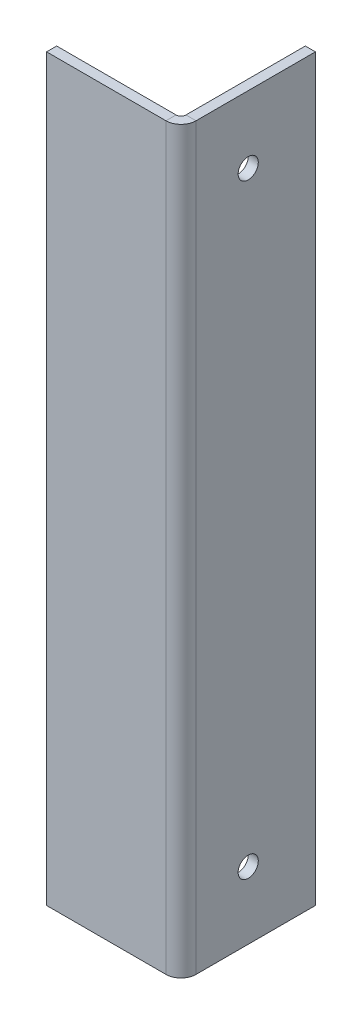
ISO-10303-21;
HEADER;
FILE_DESCRIPTION(('STEP AP214'),'2;1');
FILE_NAME('part.step','',(''),(''),'','','');
FILE_SCHEMA(('AUTOMOTIVE_DESIGN { 1 0 10303 214 1 1 1 1 }'));
ENDSEC;
DATA;
#1=APPLICATION_CONTEXT('core data for automotive mechanical design processes');
#2=APPLICATION_PROTOCOL_DEFINITION('international standard','automotive_design',2000,#1);
#3=PRODUCT_CONTEXT('',#1,'mechanical');
#4=PRODUCT('Part','Part','',(#3));
#5=PRODUCT_RELATED_PRODUCT_CATEGORY('part','',(#4));
#6=PRODUCT_DEFINITION_FORMATION('','',#4);
#7=PRODUCT_DEFINITION_CONTEXT('part definition',#1,'design');
#8=PRODUCT_DEFINITION('design','',#6,#7);
#9=PRODUCT_DEFINITION_SHAPE('','',#8);
#10=(LENGTH_UNIT() NAMED_UNIT(*) SI_UNIT(.MILLI.,.METRE.));
#11=(NAMED_UNIT(*) PLANE_ANGLE_UNIT() SI_UNIT($,.RADIAN.));
#12=(NAMED_UNIT(*) SI_UNIT($,.STERADIAN.) SOLID_ANGLE_UNIT());
#13=UNCERTAINTY_MEASURE_WITH_UNIT(LENGTH_MEASURE(1.E-05),#10,'distance_accuracy_value','');
#14=(GEOMETRIC_REPRESENTATION_CONTEXT(3) GLOBAL_UNCERTAINTY_ASSIGNED_CONTEXT((#13)) GLOBAL_UNIT_ASSIGNED_CONTEXT((#10,
#11,#12)) REPRESENTATION_CONTEXT('',''));
#15=CARTESIAN_POINT('',(0.,0.,0.));
#16=DIRECTION('',(0.,0.,1.));
#17=DIRECTION('',(1.,0.,0.));
#18=AXIS2_PLACEMENT_3D('',#15,#16,#17);
#19=CARTESIAN_POINT('',(-2.2366,110.,20.));
#20=DIRECTION('',(0.,1.,0.));
#21=DIRECTION('',(0.,0.,1.));
#22=AXIS2_PLACEMENT_3D('',#19,#20,#21);
#23=PLANE('',#22);
#24=DIRECTION('',(0.,0.,-1.));
#25=VECTOR('',#24,1.);
#26=CARTESIAN_POINT('',(-2.2366,110.,20.));
#27=LINE('',#26,#25);
#28=CARTESIAN_POINT('',(-2.2366,110.,20.));
#29=VERTEX_POINT('',#28);
#30=CARTESIAN_POINT('',(-2.2366,110.,18.5));
#31=VERTEX_POINT('',#30);
#32=EDGE_CURVE('E13',#29,#31,#27,.T.);
#33=ORIENTED_EDGE('',*,*,#32,.F.);
#34=CARTESIAN_POINT('',(-2.2366,110.,17.7634));
#35=DIRECTION('',(0.,1.,0.));
#36=DIRECTION('',(0.,0.,1.));
#37=AXIS2_PLACEMENT_3D('',#34,#35,#36);
#38=CIRCLE('',#37,2.2366);
#39=CARTESIAN_POINT('',(0.,110.,17.7634));
#40=VERTEX_POINT('',#39);
#41=EDGE_CURVE('E145',#40,#29,#38,.F.);
#42=ORIENTED_EDGE('',*,*,#41,.F.);
#43=DIRECTION('',(1.,0.,0.));
#44=VECTOR('',#43,1.);
#45=CARTESIAN_POINT('',(-1.5,110.,17.7634));
#46=LINE('',#45,#44);
#47=CARTESIAN_POINT('',(-1.5,110.,17.7634));
#48=VERTEX_POINT('',#47);
#49=EDGE_CURVE('E56',#48,#40,#46,.T.);
#50=ORIENTED_EDGE('',*,*,#49,.F.);
#51=CARTESIAN_POINT('',(-2.2366,110.,17.7634));
#52=DIRECTION('',(0.,1.,0.));
#53=DIRECTION('',(1.,0.,0.));
#54=AXIS2_PLACEMENT_3D('',#51,#52,#53);
#55=CIRCLE('',#54,0.7366);
#56=EDGE_CURVE('E138',#48,#31,#55,.F.);
#57=ORIENTED_EDGE('',*,*,#56,.T.);
#58=EDGE_LOOP('',(#33,#42,#50,#57));
#59=FACE_BOUND('',#58,.T.);
#60=ADVANCED_FACE('F48',(#59),#23,.T.);
#61=CARTESIAN_POINT('',(-1.5,110.,17.7634));
#62=DIRECTION('',(0.,1.,0.));
#63=DIRECTION('',(0.,0.,1.));
#64=AXIS2_PLACEMENT_3D('',#61,#62,#63);
#65=PLANE('',#64);
#66=DIRECTION('',(-1.,0.,0.));
#67=VECTOR('',#66,1.);
#68=CARTESIAN_POINT('',(0.,110.,20.));
#69=LINE('',#68,#67);
#70=CARTESIAN_POINT('',(-20.,110.,20.));
#71=VERTEX_POINT('',#70);
#72=EDGE_CURVE('E195',#29,#71,#69,.T.);
#73=ORIENTED_EDGE('',*,*,#72,.F.);
#74=ORIENTED_EDGE('',*,*,#32,.T.);
#75=DIRECTION('',(1.,0.,0.));
#76=VECTOR('',#75,1.);
#77=CARTESIAN_POINT('',(0.,110.,18.5));
#78=LINE('',#77,#76);
#79=CARTESIAN_POINT('',(-20.,110.,18.5));
#80=VERTEX_POINT('',#79);
#81=EDGE_CURVE('E104',#31,#80,#78,.F.);
#82=ORIENTED_EDGE('',*,*,#81,.T.);
#83=DIRECTION('',(0.,0.,-1.));
#84=VECTOR('',#83,1.);
#85=CARTESIAN_POINT('',(-20.,110.,20.));
#86=LINE('',#85,#84);
#87=EDGE_CURVE('E361',#71,#80,#86,.T.);
#88=ORIENTED_EDGE('',*,*,#87,.F.);
#89=EDGE_LOOP('',(#73,#74,#82,#88));
#90=FACE_BOUND('',#89,.T.);
#91=ADVANCED_FACE('F203',(#90),#65,.T.);
#92=CARTESIAN_POINT('',(0.,0.,17.7634));
#93=DIRECTION('',(0.,-1.,0.));
#94=DIRECTION('',(0.,0.,-1.));
#95=AXIS2_PLACEMENT_3D('',#92,#93,#94);
#96=PLANE('',#95);
#97=DIRECTION('',(-1.,0.,0.));
#98=VECTOR('',#97,1.);
#99=CARTESIAN_POINT('',(0.,0.,17.7634));
#100=LINE('',#99,#98);
#101=CARTESIAN_POINT('',(0.,0.,17.7634));
#102=VERTEX_POINT('',#101);
#103=CARTESIAN_POINT('',(-1.5,0.,17.7634));
#104=VERTEX_POINT('',#103);
#105=EDGE_CURVE('E91',#102,#104,#100,.T.);
#106=ORIENTED_EDGE('',*,*,#105,.F.);
#107=CARTESIAN_POINT('',(-2.2366,0.,17.7634));
#108=DIRECTION('',(0.,1.,0.));
#109=DIRECTION('',(0.,0.,1.));
#110=AXIS2_PLACEMENT_3D('',#107,#108,#109);
#111=CIRCLE('',#110,2.2366);
#112=CARTESIAN_POINT('',(-2.2366,0.,20.));
#113=VERTEX_POINT('',#112);
#114=EDGE_CURVE('E161',#102,#113,#111,.F.);
#115=ORIENTED_EDGE('',*,*,#114,.T.);
#116=DIRECTION('',(0.,0.,1.));
#117=VECTOR('',#116,1.);
#118=CARTESIAN_POINT('',(-2.2366,0.,18.5));
#119=LINE('',#118,#117);
#120=CARTESIAN_POINT('',(-2.2366,0.,18.5));
#121=VERTEX_POINT('',#120);
#122=EDGE_CURVE('E98',#121,#113,#119,.T.);
#123=ORIENTED_EDGE('',*,*,#122,.F.);
#124=CARTESIAN_POINT('',(-2.2366,0.,17.7634));
#125=DIRECTION('',(0.,1.,0.));
#126=DIRECTION('',(1.,0.,0.));
#127=AXIS2_PLACEMENT_3D('',#124,#125,#126);
#128=CIRCLE('',#127,0.7366);
#129=EDGE_CURVE('E168',#104,#121,#128,.F.);
#130=ORIENTED_EDGE('',*,*,#129,.F.);
#131=EDGE_LOOP('',(#106,#115,#123,#130));
#132=FACE_BOUND('',#131,.T.);
#133=ADVANCED_FACE('F201',(#132),#96,.T.);
#134=CARTESIAN_POINT('',(-2.2366,0.,18.5));
#135=DIRECTION('',(0.,-1.,0.));
#136=DIRECTION('',(0.,0.,-1.));
#137=AXIS2_PLACEMENT_3D('',#134,#135,#136);
#138=PLANE('',#137);
#139=DIRECTION('',(0.,0.,1.));
#140=VECTOR('',#139,1.);
#141=CARTESIAN_POINT('',(0.,0.,0.));
#142=LINE('',#141,#140);
#143=CARTESIAN_POINT('',(0.,0.,0.));
#144=VERTEX_POINT('',#143);
#145=EDGE_CURVE('E163',#144,#102,#142,.T.);
#146=ORIENTED_EDGE('',*,*,#145,.T.);
#147=ORIENTED_EDGE('',*,*,#105,.T.);
#148=DIRECTION('',(0.,0.,1.));
#149=VECTOR('',#148,1.);
#150=CARTESIAN_POINT('',(-1.5,0.,0.));
#151=LINE('',#150,#149);
#152=CARTESIAN_POINT('',(-1.5,0.,0.));
#153=VERTEX_POINT('',#152);
#154=EDGE_CURVE('E166',#153,#104,#151,.T.);
#155=ORIENTED_EDGE('',*,*,#154,.F.);
#156=DIRECTION('',(1.,0.,0.));
#157=VECTOR('',#156,1.);
#158=CARTESIAN_POINT('',(-1.5,0.,0.));
#159=LINE('',#158,#157);
#160=EDGE_CURVE('E126',#153,#144,#159,.T.);
#161=ORIENTED_EDGE('',*,*,#160,.T.);
#162=EDGE_LOOP('',(#146,#147,#155,#161));
#163=FACE_BOUND('',#162,.T.);
#164=ADVANCED_FACE('F197',(#163),#138,.T.);
#165=CARTESIAN_POINT('',(0.,110.,18.5));
#166=DIRECTION('',(0.,0.,1.));
#167=DIRECTION('',(1.,0.,0.));
#168=AXIS2_PLACEMENT_3D('',#165,#166,#167);
#169=PLANE('',#168);
#170=DIRECTION('',(1.,0.,0.));
#171=VECTOR('',#170,1.);
#172=CARTESIAN_POINT('',(0.,0.,18.5));
#173=LINE('',#172,#171);
#174=CARTESIAN_POINT('',(-20.,0.,18.5));
#175=VERTEX_POINT('',#174);
#176=EDGE_CURVE('E151',#121,#175,#173,.F.);
#177=ORIENTED_EDGE('',*,*,#176,.T.);
#178=DIRECTION('',(0.,-1.,0.));
#179=VECTOR('',#178,1.);
#180=CARTESIAN_POINT('',(-20.,110.,18.5));
#181=LINE('',#180,#179);
#182=EDGE_CURVE('E182',#80,#175,#181,.T.);
#183=ORIENTED_EDGE('',*,*,#182,.F.);
#184=ORIENTED_EDGE('',*,*,#81,.F.);
#185=DIRECTION('',(0.,-1.,0.));
#186=VECTOR('',#185,1.);
#187=CARTESIAN_POINT('',(-2.2366,110.,18.5));
#188=LINE('',#187,#186);
#189=EDGE_CURVE('E150',#31,#121,#188,.T.);
#190=ORIENTED_EDGE('',*,*,#189,.T.);
#191=EDGE_LOOP('',(#177,#183,#184,#190));
#192=FACE_BOUND('',#191,.T.);
#193=ADVANCED_FACE('F209',(#192),#169,.F.);
#194=CARTESIAN_POINT('',(-20.,110.,20.));
#195=DIRECTION('',(-1.,0.,0.));
#196=DIRECTION('',(0.,0.,1.));
#197=AXIS2_PLACEMENT_3D('',#194,#195,#196);
#198=PLANE('',#197);
#199=DIRECTION('',(0.,0.,-1.));
#200=VECTOR('',#199,1.);
#201=CARTESIAN_POINT('',(-20.,0.,20.));
#202=LINE('',#201,#200);
#203=CARTESIAN_POINT('',(-20.,0.,20.));
#204=VERTEX_POINT('',#203);
#205=EDGE_CURVE('E154',#204,#175,#202,.T.);
#206=ORIENTED_EDGE('',*,*,#205,.F.);
#207=DIRECTION('',(0.,-1.,0.));
#208=VECTOR('',#207,1.);
#209=CARTESIAN_POINT('',(-20.,110.,20.));
#210=LINE('',#209,#208);
#211=EDGE_CURVE('E180',#71,#204,#210,.T.);
#212=ORIENTED_EDGE('',*,*,#211,.F.);
#213=ORIENTED_EDGE('',*,*,#87,.T.);
#214=ORIENTED_EDGE('',*,*,#182,.T.);
#215=EDGE_LOOP('',(#206,#212,#213,#214));
#216=FACE_BOUND('',#215,.T.);
#217=ADVANCED_FACE('F240',(#216),#198,.T.);
#218=CARTESIAN_POINT('',(0.,110.,20.));
#219=DIRECTION('',(0.,0.,1.));
#220=DIRECTION('',(1.,0.,0.));
#221=AXIS2_PLACEMENT_3D('',#218,#219,#220);
#222=PLANE('',#221);
#223=DIRECTION('',(-1.,0.,0.));
#224=VECTOR('',#223,1.);
#225=CARTESIAN_POINT('',(0.,0.,20.));
#226=LINE('',#225,#224);
#227=EDGE_CURVE('E158',#113,#204,#226,.T.);
#228=ORIENTED_EDGE('',*,*,#227,.F.);
#229=DIRECTION('',(0.,-1.,0.));
#230=VECTOR('',#229,1.);
#231=CARTESIAN_POINT('',(-2.2366,110.,20.));
#232=LINE('',#231,#230);
#233=EDGE_CURVE('E177',#29,#113,#232,.T.);
#234=ORIENTED_EDGE('',*,*,#233,.F.);
#235=ORIENTED_EDGE('',*,*,#72,.T.);
#236=ORIENTED_EDGE('',*,*,#211,.T.);
#237=EDGE_LOOP('',(#228,#234,#235,#236));
#238=FACE_BOUND('',#237,.T.);
#239=ADVANCED_FACE('F251',(#238),#222,.T.);
#240=CARTESIAN_POINT('',(-2.2366,110.,17.7634));
#241=DIRECTION('',(0.,-1.,0.));
#242=DIRECTION('',(0.,0.,-1.));
#243=AXIS2_PLACEMENT_3D('',#240,#241,#242);
#244=CYLINDRICAL_SURFACE('',#243,2.2366);
#245=ORIENTED_EDGE('',*,*,#114,.F.);
#246=DIRECTION('',(0.,-1.,0.));
#247=VECTOR('',#246,1.);
#248=CARTESIAN_POINT('',(0.,110.,17.7634));
#249=LINE('',#248,#247);
#250=EDGE_CURVE('E174',#40,#102,#249,.T.);
#251=ORIENTED_EDGE('',*,*,#250,.F.);
#252=ORIENTED_EDGE('',*,*,#41,.T.);
#253=ORIENTED_EDGE('',*,*,#233,.T.);
#254=EDGE_LOOP('',(#245,#251,#252,#253));
#255=FACE_BOUND('',#254,.T.);
#256=ADVANCED_FACE('F191',(#255),#244,.T.);
#257=CARTESIAN_POINT('',(0.,110.,0.));
#258=DIRECTION('',(1.,0.,0.));
#259=DIRECTION('',(0.,0.,-1.));
#260=AXIS2_PLACEMENT_3D('',#257,#258,#259);
#261=PLANE('',#260);
#262=CARTESIAN_POINT('',(0.,100.,10.));
#263=DIRECTION('',(1.,0.,0.));
#264=DIRECTION('',(0.,0.,-1.));
#265=AXIS2_PLACEMENT_3D('',#262,#263,#264);
#266=CIRCLE('',#265,1.49999999999999);
#267=CARTESIAN_POINT('',(0.,100.,8.50000000000001));
#268=VERTEX_POINT('',#267);
#269=EDGE_CURVE('E348',#268,#268,#266,.T.);
#270=ORIENTED_EDGE('',*,*,#269,.F.);
#271=EDGE_LOOP('',(#270));
#272=FACE_BOUND('',#271,.T.);
#273=CARTESIAN_POINT('',(0.,10.,10.));
#274=DIRECTION('',(1.,0.,0.));
#275=DIRECTION('',(0.,0.,-1.));
#276=AXIS2_PLACEMENT_3D('',#273,#274,#275);
#277=CIRCLE('',#276,1.49999999999999);
#278=CARTESIAN_POINT('',(0.,10.,8.50000000000001));
#279=VERTEX_POINT('',#278);
#280=EDGE_CURVE('E155',#279,#279,#277,.T.);
#281=ORIENTED_EDGE('',*,*,#280,.F.);
#282=EDGE_LOOP('',(#281));
#283=FACE_BOUND('',#282,.T.);
#284=ORIENTED_EDGE('',*,*,#145,.F.);
#285=DIRECTION('',(0.,-1.,0.));
#286=VECTOR('',#285,1.);
#287=CARTESIAN_POINT('',(0.,110.,0.));
#288=LINE('',#287,#286);
#289=CARTESIAN_POINT('',(0.,110.,0.));
#290=VERTEX_POINT('',#289);
#291=EDGE_CURVE('E128',#290,#144,#288,.T.);
#292=ORIENTED_EDGE('',*,*,#291,.F.);
#293=DIRECTION('',(0.,0.,1.));
#294=VECTOR('',#293,1.);
#295=CARTESIAN_POINT('',(0.,110.,0.));
#296=LINE('',#295,#294);
#297=EDGE_CURVE('E143',#290,#40,#296,.T.);
#298=ORIENTED_EDGE('',*,*,#297,.T.);
#299=ORIENTED_EDGE('',*,*,#250,.T.);
#300=EDGE_LOOP('',(#284,#292,#298,#299));
#301=FACE_BOUND('',#300,.T.);
#302=ADVANCED_FACE('F196',(#272,#283,#301),#261,.T.);
#303=CARTESIAN_POINT('',(-1.5,110.,0.));
#304=DIRECTION('',(0.,0.,-1.));
#305=DIRECTION('',(-1.,0.,0.));
#306=AXIS2_PLACEMENT_3D('',#303,#304,#305);
#307=PLANE('',#306);
#308=ORIENTED_EDGE('',*,*,#160,.F.);
#309=DIRECTION('',(0.,-1.,0.));
#310=VECTOR('',#309,1.);
#311=CARTESIAN_POINT('',(-1.5,110.,0.));
#312=LINE('',#311,#310);
#313=CARTESIAN_POINT('',(-1.5,110.,0.));
#314=VERTEX_POINT('',#313);
#315=EDGE_CURVE('E120',#314,#153,#312,.T.);
#316=ORIENTED_EDGE('',*,*,#315,.F.);
#317=DIRECTION('',(1.,0.,0.));
#318=VECTOR('',#317,1.);
#319=CARTESIAN_POINT('',(-1.5,110.,0.));
#320=LINE('',#319,#318);
#321=EDGE_CURVE('E124',#314,#290,#320,.T.);
#322=ORIENTED_EDGE('',*,*,#321,.T.);
#323=ORIENTED_EDGE('',*,*,#291,.T.);
#324=EDGE_LOOP('',(#308,#316,#322,#323));
#325=FACE_BOUND('',#324,.T.);
#326=ADVANCED_FACE('F122',(#325),#307,.T.);
#327=CARTESIAN_POINT('',(-1.5,110.,0.));
#328=DIRECTION('',(1.,0.,0.));
#329=DIRECTION('',(0.,0.,-1.));
#330=AXIS2_PLACEMENT_3D('',#327,#328,#329);
#331=PLANE('',#330);
#332=CARTESIAN_POINT('',(-1.5,100.,10.));
#333=DIRECTION('',(-1.,0.,0.));
#334=DIRECTION('',(0.,0.,1.));
#335=AXIS2_PLACEMENT_3D('',#332,#333,#334);
#336=CIRCLE('',#335,1.49999999999999);
#337=CARTESIAN_POINT('',(-1.5,100.,11.5));
#338=VERTEX_POINT('',#337);
#339=EDGE_CURVE('E351',#338,#338,#336,.T.);
#340=ORIENTED_EDGE('',*,*,#339,.F.);
#341=EDGE_LOOP('',(#340));
#342=FACE_BOUND('',#341,.T.);
#343=CARTESIAN_POINT('',(-1.5,10.,10.));
#344=DIRECTION('',(-1.,0.,0.));
#345=DIRECTION('',(0.,0.,1.));
#346=AXIS2_PLACEMENT_3D('',#343,#344,#345);
#347=CIRCLE('',#346,1.49999999999999);
#348=CARTESIAN_POINT('',(-1.5,10.,11.5));
#349=VERTEX_POINT('',#348);
#350=EDGE_CURVE('E353',#349,#349,#347,.T.);
#351=ORIENTED_EDGE('',*,*,#350,.F.);
#352=EDGE_LOOP('',(#351));
#353=FACE_BOUND('',#352,.T.);
#354=ORIENTED_EDGE('',*,*,#154,.T.);
#355=DIRECTION('',(0.,-1.,0.));
#356=VECTOR('',#355,1.);
#357=CARTESIAN_POINT('',(-1.5,110.,17.7634));
#358=LINE('',#357,#356);
#359=EDGE_CURVE('E129',#48,#104,#358,.T.);
#360=ORIENTED_EDGE('',*,*,#359,.F.);
#361=DIRECTION('',(0.,0.,1.));
#362=VECTOR('',#361,1.);
#363=CARTESIAN_POINT('',(-1.5,110.,0.));
#364=LINE('',#363,#362);
#365=EDGE_CURVE('E133',#314,#48,#364,.T.);
#366=ORIENTED_EDGE('',*,*,#365,.F.);
#367=ORIENTED_EDGE('',*,*,#315,.T.);
#368=EDGE_LOOP('',(#354,#360,#366,#367));
#369=FACE_BOUND('',#368,.T.);
#370=ADVANCED_FACE('F134',(#342,#353,#369),#331,.F.);
#371=CARTESIAN_POINT('',(-2.2366,110.,17.7634));
#372=DIRECTION('',(0.,-1.,0.));
#373=DIRECTION('',(0.,0.,-1.));
#374=AXIS2_PLACEMENT_3D('',#371,#372,#373);
#375=CYLINDRICAL_SURFACE('',#374,0.7366);
#376=ORIENTED_EDGE('',*,*,#129,.T.);
#377=ORIENTED_EDGE('',*,*,#189,.F.);
#378=ORIENTED_EDGE('',*,*,#56,.F.);
#379=ORIENTED_EDGE('',*,*,#359,.T.);
#380=EDGE_LOOP('',(#376,#377,#378,#379));
#381=FACE_BOUND('',#380,.T.);
#382=ADVANCED_FACE('F199',(#381),#375,.F.);
#383=CARTESIAN_POINT('',(-2.2366,110.,17.7634));
#384=DIRECTION('',(0.,1.,0.));
#385=DIRECTION('',(1.,0.,0.));
#386=AXIS2_PLACEMENT_3D('',#383,#384,#385);
#387=PLANE('',#386);
#388=ORIENTED_EDGE('',*,*,#365,.T.);
#389=ORIENTED_EDGE('',*,*,#49,.T.);
#390=ORIENTED_EDGE('',*,*,#297,.F.);
#391=ORIENTED_EDGE('',*,*,#321,.F.);
#392=EDGE_LOOP('',(#388,#389,#390,#391));
#393=FACE_BOUND('',#392,.T.);
#394=ADVANCED_FACE('F141',(#393),#387,.T.);
#395=CARTESIAN_POINT('',(-2.2366,0.,17.7634));
#396=DIRECTION('',(0.,1.,0.));
#397=DIRECTION('',(1.,0.,0.));
#398=AXIS2_PLACEMENT_3D('',#395,#396,#397);
#399=PLANE('',#398);
#400=ORIENTED_EDGE('',*,*,#176,.F.);
#401=ORIENTED_EDGE('',*,*,#122,.T.);
#402=ORIENTED_EDGE('',*,*,#227,.T.);
#403=ORIENTED_EDGE('',*,*,#205,.T.);
#404=EDGE_LOOP('',(#400,#401,#402,#403));
#405=FACE_BOUND('',#404,.T.);
#406=ADVANCED_FACE('F295',(#405),#399,.F.);
#407=CARTESIAN_POINT('',(-1.5,10.,10.));
#408=DIRECTION('',(-1.,0.,0.));
#409=DIRECTION('',(0.,0.,1.));
#410=AXIS2_PLACEMENT_3D('',#407,#408,#409);
#411=CYLINDRICAL_SURFACE('',#410,1.49999999999999);
#412=ORIENTED_EDGE('',*,*,#280,.T.);
#413=EDGE_LOOP('',(#412));
#414=FACE_BOUND('',#413,.T.);
#415=ORIENTED_EDGE('',*,*,#350,.T.);
#416=EDGE_LOOP('',(#415));
#417=FACE_BOUND('',#416,.T.);
#418=ADVANCED_FACE('F305',(#414,#417),#411,.F.);
#419=CARTESIAN_POINT('',(-1.5,100.,10.));
#420=DIRECTION('',(-1.,0.,0.));
#421=DIRECTION('',(0.,0.,1.));
#422=AXIS2_PLACEMENT_3D('',#419,#420,#421);
#423=CYLINDRICAL_SURFACE('',#422,1.49999999999999);
#424=ORIENTED_EDGE('',*,*,#269,.T.);
#425=EDGE_LOOP('',(#424));
#426=FACE_BOUND('',#425,.T.);
#427=ORIENTED_EDGE('',*,*,#339,.T.);
#428=EDGE_LOOP('',(#427));
#429=FACE_BOUND('',#428,.T.);
#430=ADVANCED_FACE('F331',(#426,#429),#423,.F.);
#431=CLOSED_SHELL('',(#60,#91,#133,#164,#193,#217,#239,#256,#302,#326,#370,#382,#394,#406,#418,#430));
#432=MANIFOLD_SOLID_BREP('B2',#431);
#433=ADVANCED_BREP_SHAPE_REPRESENTATION('',(#18,#432),#14);
#434=SHAPE_DEFINITION_REPRESENTATION(#9,#433);
ENDSEC;
END-ISO-10303-21;
